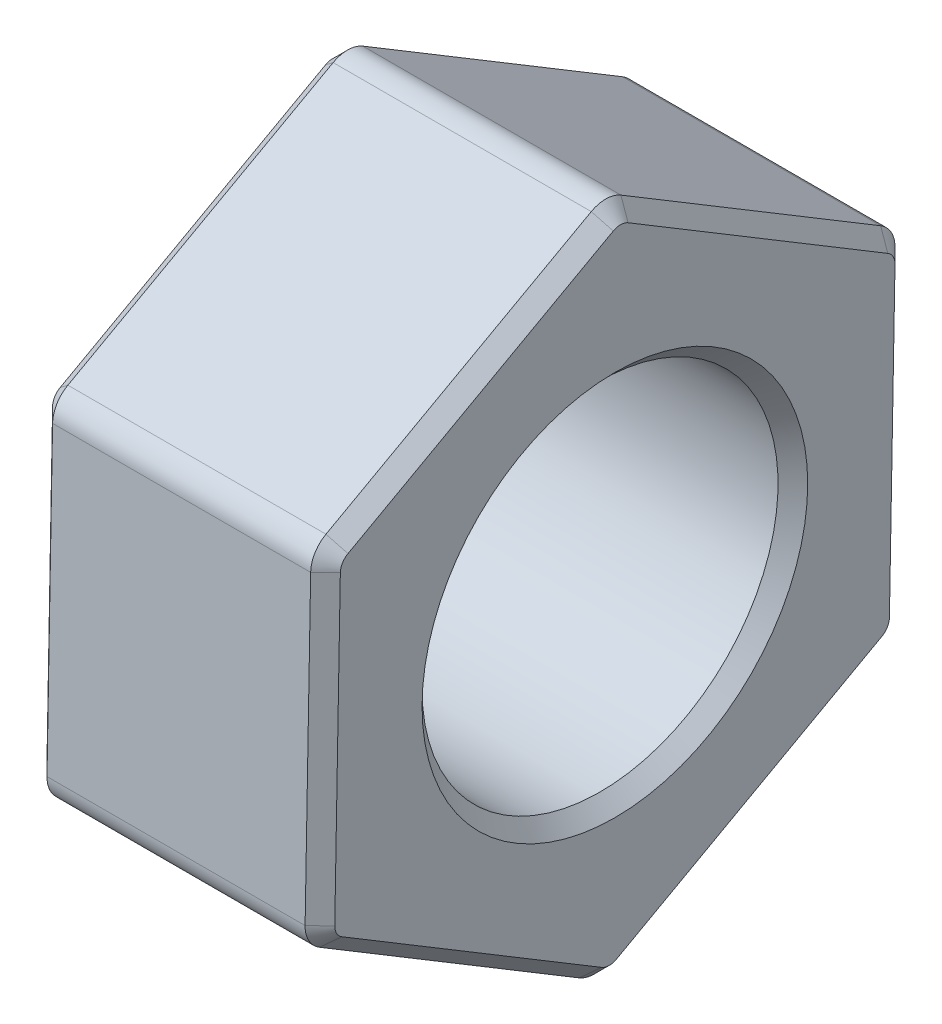
ISO-10303-21;
HEADER;
FILE_DESCRIPTION(('STEP AP214'),'2;1');
FILE_NAME('part.step','',(''),(''),'','','');
FILE_SCHEMA(('AUTOMOTIVE_DESIGN { 1 0 10303 214 1 1 1 1 }'));
ENDSEC;
DATA;
#1=APPLICATION_CONTEXT('core data for automotive mechanical design processes');
#2=APPLICATION_PROTOCOL_DEFINITION('international standard','automotive_design',2000,#1);
#3=PRODUCT_CONTEXT('',#1,'mechanical');
#4=PRODUCT('Part','Part','',(#3));
#5=PRODUCT_RELATED_PRODUCT_CATEGORY('part','',(#4));
#6=PRODUCT_DEFINITION_FORMATION('','',#4);
#7=PRODUCT_DEFINITION_CONTEXT('part definition',#1,'design');
#8=PRODUCT_DEFINITION('design','',#6,#7);
#9=PRODUCT_DEFINITION_SHAPE('','',#8);
#10=(LENGTH_UNIT() NAMED_UNIT(*) SI_UNIT(.MILLI.,.METRE.));
#11=(NAMED_UNIT(*) PLANE_ANGLE_UNIT() SI_UNIT($,.RADIAN.));
#12=(NAMED_UNIT(*) SI_UNIT($,.STERADIAN.) SOLID_ANGLE_UNIT());
#13=UNCERTAINTY_MEASURE_WITH_UNIT(LENGTH_MEASURE(1.E-05),#10,'distance_accuracy_value','');
#14=(GEOMETRIC_REPRESENTATION_CONTEXT(3) GLOBAL_UNCERTAINTY_ASSIGNED_CONTEXT((#13)) GLOBAL_UNIT_ASSIGNED_CONTEXT((#10,
#11,#12)) REPRESENTATION_CONTEXT('',''));
#15=CARTESIAN_POINT('',(0.,0.,0.));
#16=DIRECTION('',(0.,0.,1.));
#17=DIRECTION('',(1.,0.,0.));
#18=AXIS2_PLACEMENT_3D('',#15,#16,#17);
#19=CARTESIAN_POINT('',(4.85,2.47301348110481,-4.47120837383742));
#20=DIRECTION('',(-1.,0.,0.));
#21=DIRECTION('',(0.,0.,1.));
#22=AXIS2_PLACEMENT_3D('',#19,#20,#21);
#23=PLANE('',#22);
#24=CARTESIAN_POINT('',(4.85,0.,0.));
#25=DIRECTION('',(-1.,0.,0.));
#26=DIRECTION('',(0.,0.,1.));
#27=AXIS2_PLACEMENT_3D('',#24,#25,#26);
#28=CIRCLE('',#27,3.25);
#29=CARTESIAN_POINT('',(4.85,0.,3.25));
#30=VERTEX_POINT('',#29);
#31=EDGE_CURVE('E11',#30,#30,#28,.T.);
#32=ORIENTED_EDGE('',*,*,#31,.T.);
#33=EDGE_LOOP('',(#32));
#34=FACE_BOUND('',#33,.T.);
#35=CARTESIAN_POINT('',(4.85,-2.63567329680451,-4.37729668545686));
#36=DIRECTION('',(-1.,0.,0.));
#37=DIRECTION('',(0.,0.,1.));
#38=AXIS2_PLACEMENT_3D('',#35,#36,#37);
#39=CIRCLE('',#38,0.250000000000004);
#40=CARTESIAN_POINT('',(4.85,-2.85444053055349,-4.49829626164546));
#41=VERTEX_POINT('',#40);
#42=CARTESIAN_POINT('',(4.85,-2.64026820685252,-4.62725445549343));
#43=VERTEX_POINT('',#42);
#44=EDGE_CURVE('E49',#41,#43,#39,.F.);
#45=ORIENTED_EDGE('',*,*,#44,.T.);
#46=DIRECTION('',(0.,0.999831080146247,-0.0183796401920564));
#47=VECTOR('',#46,1.);
#48=CARTESIAN_POINT('',(4.85,2.46841857105679,-4.72116614387398));
#49=LINE('',#48,#47);
#50=CARTESIAN_POINT('',(4.85,2.46841857105679,-4.72116614387398));
#51=VERTEX_POINT('',#50);
#52=EDGE_CURVE('E41',#43,#51,#49,.T.);
#53=ORIENTED_EDGE('',*,*,#52,.T.);
#54=CARTESIAN_POINT('',(4.85,2.47301348110481,-4.47120837383742));
#55=DIRECTION('',(-1.,0.,0.));
#56=DIRECTION('',(0.,0.,1.));
#57=AXIS2_PLACEMENT_3D('',#54,#55,#56);
#58=CIRCLE('',#57,0.250000000000004);
#59=CARTESIAN_POINT('',(4.85,2.68718580480578,-4.60016656768538));
#60=VERTEX_POINT('',#59);
#61=EDGE_CURVE('E284',#51,#60,#58,.F.);
#62=ORIENTED_EDGE('',*,*,#61,.T.);
#63=DIRECTION('',(0.,0.515832775391862,0.856689294803856));
#64=VECTOR('',#63,1.);
#65=CARTESIAN_POINT('',(4.85,2.68718580480578,-4.60016656768539));
#66=LINE('',#65,#64);
#67=CARTESIAN_POINT('',(4.85,5.32285910161029,-0.222869882228528));
#68=VERTEX_POINT('',#67);
#69=EDGE_CURVE('E286',#60,#68,#66,.T.);
#70=ORIENTED_EDGE('',*,*,#69,.T.);
#71=CARTESIAN_POINT('',(4.85,5.10868677790932,-0.0939116883805591));
#72=DIRECTION('',(-1.,0.,0.));
#73=DIRECTION('',(0.,0.,1.));
#74=AXIS2_PLACEMENT_3D('',#71,#72,#73);
#75=CIRCLE('',#74,0.250000000000004);
#76=CARTESIAN_POINT('',(4.85,5.3274540116583,0.0270878878080406));
#77=VERTEX_POINT('',#76);
#78=EDGE_CURVE('E288',#68,#77,#75,.F.);
#79=ORIENTED_EDGE('',*,*,#78,.T.);
#80=DIRECTION('',(0.,-0.483998304754384,0.875068934995913));
#81=VECTOR('',#80,1.);
#82=CARTESIAN_POINT('',(4.85,6.56396075221071,-2.20851629911067));
#83=LINE('',#82,#81);
#84=CARTESIAN_POINT('',(4.85,2.85444053055349,4.49829626164546));
#85=VERTEX_POINT('',#84);
#86=EDGE_CURVE('E290',#77,#85,#83,.T.);
#87=ORIENTED_EDGE('',*,*,#86,.T.);
#88=CARTESIAN_POINT('',(4.85,2.63567329680451,4.37729668545686));
#89=DIRECTION('',(-1.,0.,0.));
#90=DIRECTION('',(0.,0.,1.));
#91=AXIS2_PLACEMENT_3D('',#88,#89,#90);
#92=CIRCLE('',#91,0.250000000000004);
#93=CARTESIAN_POINT('',(4.85,2.64026820685252,4.62725445549343));
#94=VERTEX_POINT('',#93);
#95=EDGE_CURVE('E292',#85,#94,#92,.F.);
#96=ORIENTED_EDGE('',*,*,#95,.T.);
#97=DIRECTION('',(0.,-0.999831080146247,0.0183796401920565));
#98=VECTOR('',#97,1.);
#99=CARTESIAN_POINT('',(4.85,2.64026820685252,4.62725445549343));
#100=LINE('',#99,#98);
#101=CARTESIAN_POINT('',(4.85,-2.46841857105679,4.72116614387399));
#102=VERTEX_POINT('',#101);
#103=EDGE_CURVE('E294',#94,#102,#100,.T.);
#104=ORIENTED_EDGE('',*,*,#103,.T.);
#105=CARTESIAN_POINT('',(4.85,-2.47301348110481,4.47120837383742));
#106=DIRECTION('',(-1.,0.,0.));
#107=DIRECTION('',(0.,0.,1.));
#108=AXIS2_PLACEMENT_3D('',#105,#106,#107);
#109=CIRCLE('',#108,0.250000000000004);
#110=CARTESIAN_POINT('',(4.85,-2.68718580480578,4.60016656768539));
#111=VERTEX_POINT('',#110);
#112=EDGE_CURVE('E296',#102,#111,#109,.F.);
#113=ORIENTED_EDGE('',*,*,#112,.T.);
#114=DIRECTION('',(0.,-0.515832775391862,-0.856689294803857));
#115=VECTOR('',#114,1.);
#116=CARTESIAN_POINT('',(4.85,-5.32285910161029,0.222869882228527));
#117=LINE('',#116,#115);
#118=CARTESIAN_POINT('',(4.85,-5.32285910161029,0.222869882228528));
#119=VERTEX_POINT('',#118);
#120=EDGE_CURVE('E298',#111,#119,#117,.T.);
#121=ORIENTED_EDGE('',*,*,#120,.T.);
#122=CARTESIAN_POINT('',(4.85,-5.10868677790932,0.09391168838056));
#123=DIRECTION('',(-1.,0.,0.));
#124=DIRECTION('',(0.,0.,1.));
#125=AXIS2_PLACEMENT_3D('',#122,#123,#124);
#126=CIRCLE('',#125,0.250000000000004);
#127=CARTESIAN_POINT('',(4.85,-5.3274540116583,-0.0270878878080397));
#128=VERTEX_POINT('',#127);
#129=EDGE_CURVE('E300',#119,#128,#126,.F.);
#130=ORIENTED_EDGE('',*,*,#129,.T.);
#131=DIRECTION('',(0.,0.483998304754385,-0.875068934995913));
#132=VECTOR('',#131,1.);
#133=CARTESIAN_POINT('',(4.85,-1.61793379000109,-6.73390044856417));
#134=LINE('',#133,#132);
#135=EDGE_CURVE('E54',#128,#41,#134,.T.);
#136=ORIENTED_EDGE('',*,*,#135,.T.);
#137=EDGE_LOOP('',(#45,#53,#62,#70,#79,#87,#96,#104,#113,#121,#130,#136));
#138=FACE_BOUND('',#137,.T.);
#139=ADVANCED_FACE('F32',(#34,#138),#23,.F.);
#140=CARTESIAN_POINT('',(0.,2.47301348110481,-4.47120837383742));
#141=DIRECTION('',(-1.,0.,0.));
#142=DIRECTION('',(0.,0.,1.));
#143=AXIS2_PLACEMENT_3D('',#140,#141,#142);
#144=PLANE('',#143);
#145=CARTESIAN_POINT('',(0.,0.,0.));
#146=DIRECTION('',(-1.,0.,0.));
#147=DIRECTION('',(0.,0.,1.));
#148=AXIS2_PLACEMENT_3D('',#145,#146,#147);
#149=CIRCLE('',#148,3.25);
#150=CARTESIAN_POINT('',(0.,0.,3.25));
#151=VERTEX_POINT('',#150);
#152=EDGE_CURVE('E222',#151,#151,#149,.F.);
#153=ORIENTED_EDGE('',*,*,#152,.T.);
#154=EDGE_LOOP('',(#153));
#155=FACE_BOUND('',#154,.T.);
#156=CARTESIAN_POINT('',(0.,5.10868677790932,-0.0939116883805591));
#157=DIRECTION('',(-1.,0.,0.));
#158=DIRECTION('',(0.,0.,1.));
#159=AXIS2_PLACEMENT_3D('',#156,#157,#158);
#160=CIRCLE('',#159,0.249999999999998);
#161=CARTESIAN_POINT('',(0.,5.3274540116583,0.0270878878080372));
#162=VERTEX_POINT('',#161);
#163=CARTESIAN_POINT('',(0.,5.32285910161028,-0.222869882228526));
#164=VERTEX_POINT('',#163);
#165=EDGE_CURVE('E221',#162,#164,#160,.T.);
#166=ORIENTED_EDGE('',*,*,#165,.T.);
#167=DIRECTION('',(0.,-0.515832775391862,-0.856689294803856));
#168=VECTOR('',#167,1.);
#169=CARTESIAN_POINT('',(0.,2.68718580480577,-4.60016656768538));
#170=LINE('',#169,#168);
#171=CARTESIAN_POINT('',(0.,2.68718580480577,-4.60016656768538));
#172=VERTEX_POINT('',#171);
#173=EDGE_CURVE('E200',#164,#172,#170,.T.);
#174=ORIENTED_EDGE('',*,*,#173,.T.);
#175=CARTESIAN_POINT('',(0.,2.47301348110481,-4.47120837383742));
#176=DIRECTION('',(-1.,0.,0.));
#177=DIRECTION('',(0.,0.,1.));
#178=AXIS2_PLACEMENT_3D('',#175,#176,#177);
#179=CIRCLE('',#178,0.249999999999998);
#180=CARTESIAN_POINT('',(0.,2.46841857105679,-4.72116614387398));
#181=VERTEX_POINT('',#180);
#182=EDGE_CURVE('E210',#172,#181,#179,.T.);
#183=ORIENTED_EDGE('',*,*,#182,.T.);
#184=DIRECTION('',(0.,-0.999831080146247,0.0183796401920564));
#185=VECTOR('',#184,1.);
#186=CARTESIAN_POINT('',(0.,-2.64026820685252,-4.62725445549342));
#187=LINE('',#186,#185);
#188=CARTESIAN_POINT('',(0.,-2.64026820685252,-4.62725445549342));
#189=VERTEX_POINT('',#188);
#190=EDGE_CURVE('E216',#181,#189,#187,.T.);
#191=ORIENTED_EDGE('',*,*,#190,.T.);
#192=CARTESIAN_POINT('',(0.,-2.63567329680451,-4.37729668545686));
#193=DIRECTION('',(-1.,0.,0.));
#194=DIRECTION('',(0.,0.,1.));
#195=AXIS2_PLACEMENT_3D('',#192,#193,#194);
#196=CIRCLE('',#195,0.249999999999998);
#197=CARTESIAN_POINT('',(0.,-2.85444053055349,-4.49829626164546));
#198=VERTEX_POINT('',#197);
#199=EDGE_CURVE('E407',#189,#198,#196,.T.);
#200=ORIENTED_EDGE('',*,*,#199,.T.);
#201=DIRECTION('',(0.,-0.483998304754385,0.875068934995913));
#202=VECTOR('',#201,1.);
#203=CARTESIAN_POINT('',(0.,-5.3274540116583,-0.0270878878080373));
#204=LINE('',#203,#202);
#205=CARTESIAN_POINT('',(0.,-5.3274540116583,-0.0270878878080365));
#206=VERTEX_POINT('',#205);
#207=EDGE_CURVE('E409',#198,#206,#204,.T.);
#208=ORIENTED_EDGE('',*,*,#207,.T.);
#209=CARTESIAN_POINT('',(0.,-5.10868677790932,0.09391168838056));
#210=DIRECTION('',(-1.,0.,0.));
#211=DIRECTION('',(0.,0.,1.));
#212=AXIS2_PLACEMENT_3D('',#209,#210,#211);
#213=CIRCLE('',#212,0.249999999999998);
#214=CARTESIAN_POINT('',(0.,-5.32285910161028,0.222869882228527));
#215=VERTEX_POINT('',#214);
#216=EDGE_CURVE('E411',#206,#215,#213,.T.);
#217=ORIENTED_EDGE('',*,*,#216,.T.);
#218=DIRECTION('',(0.,0.515832775391862,0.856689294803857));
#219=VECTOR('',#218,1.);
#220=CARTESIAN_POINT('',(0.,-2.68718580480577,4.60016656768538));
#221=LINE('',#220,#219);
#222=CARTESIAN_POINT('',(0.,-2.68718580480577,4.60016656768538));
#223=VERTEX_POINT('',#222);
#224=EDGE_CURVE('E413',#215,#223,#221,.T.);
#225=ORIENTED_EDGE('',*,*,#224,.T.);
#226=CARTESIAN_POINT('',(0.,-2.47301348110481,4.47120837383742));
#227=DIRECTION('',(-1.,0.,0.));
#228=DIRECTION('',(0.,0.,1.));
#229=AXIS2_PLACEMENT_3D('',#226,#227,#228);
#230=CIRCLE('',#229,0.249999999999998);
#231=CARTESIAN_POINT('',(0.,-2.46841857105679,4.72116614387398));
#232=VERTEX_POINT('',#231);
#233=EDGE_CURVE('E415',#223,#232,#230,.T.);
#234=ORIENTED_EDGE('',*,*,#233,.T.);
#235=DIRECTION('',(0.,0.999831080146247,-0.0183796401920565));
#236=VECTOR('',#235,1.);
#237=CARTESIAN_POINT('',(0.,2.64026820685252,4.62725445549342));
#238=LINE('',#237,#236);
#239=CARTESIAN_POINT('',(0.,2.64026820685252,4.62725445549342));
#240=VERTEX_POINT('',#239);
#241=EDGE_CURVE('E417',#232,#240,#238,.T.);
#242=ORIENTED_EDGE('',*,*,#241,.T.);
#243=CARTESIAN_POINT('',(0.,2.63567329680451,4.37729668545686));
#244=DIRECTION('',(-1.,0.,0.));
#245=DIRECTION('',(0.,0.,1.));
#246=AXIS2_PLACEMENT_3D('',#243,#244,#245);
#247=CIRCLE('',#246,0.249999999999998);
#248=CARTESIAN_POINT('',(0.,2.85444053055349,4.49829626164546));
#249=VERTEX_POINT('',#248);
#250=EDGE_CURVE('E419',#240,#249,#247,.T.);
#251=ORIENTED_EDGE('',*,*,#250,.T.);
#252=DIRECTION('',(0.,0.483998304754384,-0.875068934995913));
#253=VECTOR('',#252,1.);
#254=CARTESIAN_POINT('',(0.,5.3274540116583,0.0270878878080382));
#255=LINE('',#254,#253);
#256=EDGE_CURVE('E227',#249,#162,#255,.T.);
#257=ORIENTED_EDGE('',*,*,#256,.T.);
#258=EDGE_LOOP('',(#166,#174,#183,#191,#200,#208,#217,#225,#234,#242,#251,#257));
#259=FACE_BOUND('',#258,.T.);
#260=ADVANCED_FACE('F219',(#155,#259),#144,.T.);
#261=CARTESIAN_POINT('',(4.85,2.47301348110481,-4.47120837383742));
#262=DIRECTION('',(-1.,0.,0.));
#263=DIRECTION('',(0.,0.,1.));
#264=AXIS2_PLACEMENT_3D('',#261,#262,#263);
#265=CYLINDRICAL_SURFACE('',#264,0.5);
#266=DIRECTION('',(-1.,0.,0.));
#267=VECTOR('',#266,1.);
#268=CARTESIAN_POINT('',(4.85,2.46382366100878,-4.97112391391054));
#269=LINE('',#268,#267);
#270=CARTESIAN_POINT('',(4.6,2.46382366100878,-4.97112391391054));
#271=VERTEX_POINT('',#270);
#272=CARTESIAN_POINT('',(0.250000000000003,2.46382366100878,-4.97112391391054));
#273=VERTEX_POINT('',#272);
#274=EDGE_CURVE('E333',#271,#273,#269,.T.);
#275=ORIENTED_EDGE('',*,*,#274,.T.);
#276=CARTESIAN_POINT('',(0.250000000000003,2.47301348110481,-4.47120837383742));
#277=DIRECTION('',(-1.,0.,0.));
#278=DIRECTION('',(0.,0.,1.));
#279=AXIS2_PLACEMENT_3D('',#276,#277,#278);
#280=CIRCLE('',#279,0.5);
#281=CARTESIAN_POINT('',(0.250000000000003,2.90135812850674,-4.72912476153335));
#282=VERTEX_POINT('',#281);
#283=EDGE_CURVE('E282',#273,#282,#280,.F.);
#284=ORIENTED_EDGE('',*,*,#283,.T.);
#285=DIRECTION('',(-1.,0.,0.));
#286=VECTOR('',#285,1.);
#287=CARTESIAN_POINT('',(4.85,2.90135812850674,-4.72912476153335));
#288=LINE('',#287,#286);
#289=CARTESIAN_POINT('',(4.6,2.90135812850674,-4.72912476153335));
#290=VERTEX_POINT('',#289);
#291=EDGE_CURVE('E217',#290,#282,#288,.T.);
#292=ORIENTED_EDGE('',*,*,#291,.F.);
#293=CARTESIAN_POINT('',(4.6,2.47301348110481,-4.47120837383742));
#294=DIRECTION('',(-1.,0.,0.));
#295=DIRECTION('',(0.,0.,1.));
#296=AXIS2_PLACEMENT_3D('',#293,#294,#295);
#297=CIRCLE('',#296,0.5);
#298=EDGE_CURVE('E280',#290,#271,#297,.T.);
#299=ORIENTED_EDGE('',*,*,#298,.T.);
#300=EDGE_LOOP('',(#275,#284,#292,#299));
#301=FACE_BOUND('',#300,.T.);
#302=ADVANCED_FACE('F451',(#301),#265,.T.);
#303=CARTESIAN_POINT('',(4.85,2.90135812850674,-4.72912476153335));
#304=DIRECTION('',(0.,-0.856689294803856,0.515832775391862));
#305=DIRECTION('',(0.,-0.515832775391862,-0.856689294803856));
#306=AXIS2_PLACEMENT_3D('',#303,#304,#305);
#307=PLANE('',#306);
#308=ORIENTED_EDGE('',*,*,#291,.T.);
#309=DIRECTION('',(0.,0.515832775391862,0.856689294803856));
#310=VECTOR('',#309,1.);
#311=CARTESIAN_POINT('',(0.250000000000003,5.53703142531125,-0.351828076076492));
#312=LINE('',#311,#310);
#313=CARTESIAN_POINT('',(0.250000000000003,5.53703142531125,-0.351828076076492));
#314=VERTEX_POINT('',#313);
#315=EDGE_CURVE('E203',#282,#314,#312,.T.);
#316=ORIENTED_EDGE('',*,*,#315,.T.);
#317=DIRECTION('',(-1.,0.,0.));
#318=VECTOR('',#317,1.);
#319=CARTESIAN_POINT('',(4.85,5.53703142531125,-0.351828076076492));
#320=LINE('',#319,#318);
#321=CARTESIAN_POINT('',(4.6,5.53703142531125,-0.351828076076492));
#322=VERTEX_POINT('',#321);
#323=EDGE_CURVE('E401',#322,#314,#320,.T.);
#324=ORIENTED_EDGE('',*,*,#323,.F.);
#325=DIRECTION('',(0.,-0.515832775391862,-0.856689294803856));
#326=VECTOR('',#325,1.);
#327=CARTESIAN_POINT('',(4.6,2.90135812850674,-4.72912476153335));
#328=LINE('',#327,#326);
#329=EDGE_CURVE('E236',#322,#290,#328,.T.);
#330=ORIENTED_EDGE('',*,*,#329,.T.);
#331=EDGE_LOOP('',(#308,#316,#324,#330));
#332=FACE_BOUND('',#331,.T.);
#333=ADVANCED_FACE('F434',(#332),#307,.F.);
#334=CARTESIAN_POINT('',(4.85,5.10868677790932,-0.0939116883805591));
#335=DIRECTION('',(-1.,0.,0.));
#336=DIRECTION('',(0.,0.,1.));
#337=AXIS2_PLACEMENT_3D('',#334,#335,#336);
#338=CYLINDRICAL_SURFACE('',#337,0.5);
#339=ORIENTED_EDGE('',*,*,#323,.T.);
#340=CARTESIAN_POINT('',(0.250000000000003,5.10868677790932,-0.0939116883805591));
#341=DIRECTION('',(-1.,0.,0.));
#342=DIRECTION('',(0.,0.,1.));
#343=AXIS2_PLACEMENT_3D('',#340,#341,#342);
#344=CIRCLE('',#343,0.5);
#345=CARTESIAN_POINT('',(0.250000000000003,5.54622124540728,0.148087463996635));
#346=VERTEX_POINT('',#345);
#347=EDGE_CURVE('E241',#314,#346,#344,.F.);
#348=ORIENTED_EDGE('',*,*,#347,.T.);
#349=DIRECTION('',(-1.,0.,0.));
#350=VECTOR('',#349,1.);
#351=CARTESIAN_POINT('',(4.85,5.54622124540728,0.148087463996635));
#352=LINE('',#351,#350);
#353=CARTESIAN_POINT('',(4.6,5.54622124540728,0.148087463996635));
#354=VERTEX_POINT('',#353);
#355=EDGE_CURVE('E393',#354,#346,#352,.T.);
#356=ORIENTED_EDGE('',*,*,#355,.F.);
#357=CARTESIAN_POINT('',(4.6,5.10868677790932,-0.0939116883805591));
#358=DIRECTION('',(-1.,0.,0.));
#359=DIRECTION('',(0.,0.,1.));
#360=AXIS2_PLACEMENT_3D('',#357,#358,#359);
#361=CIRCLE('',#360,0.5);
#362=EDGE_CURVE('E239',#354,#322,#361,.T.);
#363=ORIENTED_EDGE('',*,*,#362,.T.);
#364=EDGE_LOOP('',(#339,#348,#356,#363));
#365=FACE_BOUND('',#364,.T.);
#366=ADVANCED_FACE('F437',(#365),#338,.T.);
#367=CARTESIAN_POINT('',(4.85,5.54622124540728,0.148087463996635));
#368=DIRECTION('',(0.,-0.875068934995913,-0.483998304754384));
#369=DIRECTION('',(0.,0.483998304754384,-0.875068934995913));
#370=AXIS2_PLACEMENT_3D('',#367,#368,#369);
#371=PLANE('',#370);
#372=ORIENTED_EDGE('',*,*,#355,.T.);
#373=DIRECTION('',(0.,-0.483998304754384,0.875068934995913));
#374=VECTOR('',#373,1.);
#375=CARTESIAN_POINT('',(0.250000000000002,3.07320776430247,4.61929583783405));
#376=LINE('',#375,#374);
#377=CARTESIAN_POINT('',(0.250000000000003,3.07320776430247,4.61929583783405));
#378=VERTEX_POINT('',#377);
#379=EDGE_CURVE('E245',#346,#378,#376,.T.);
#380=ORIENTED_EDGE('',*,*,#379,.T.);
#381=DIRECTION('',(-1.,0.,0.));
#382=VECTOR('',#381,1.);
#383=CARTESIAN_POINT('',(4.85,3.07320776430247,4.61929583783405));
#384=LINE('',#383,#382);
#385=CARTESIAN_POINT('',(4.6,3.07320776430247,4.61929583783405));
#386=VERTEX_POINT('',#385);
#387=EDGE_CURVE('E391',#386,#378,#384,.T.);
#388=ORIENTED_EDGE('',*,*,#387,.F.);
#389=DIRECTION('',(0.,0.483998304754384,-0.875068934995913));
#390=VECTOR('',#389,1.);
#391=CARTESIAN_POINT('',(4.6,5.54622124540728,0.148087463996635));
#392=LINE('',#391,#390);
#393=EDGE_CURVE('E243',#386,#354,#392,.T.);
#394=ORIENTED_EDGE('',*,*,#393,.T.);
#395=EDGE_LOOP('',(#372,#380,#388,#394));
#396=FACE_BOUND('',#395,.T.);
#397=ADVANCED_FACE('F538',(#396),#371,.F.);
#398=CARTESIAN_POINT('',(4.85,2.63567329680451,4.37729668545686));
#399=DIRECTION('',(-1.,0.,0.));
#400=DIRECTION('',(0.,0.,1.));
#401=AXIS2_PLACEMENT_3D('',#398,#399,#400);
#402=CYLINDRICAL_SURFACE('',#401,0.5);
#403=ORIENTED_EDGE('',*,*,#387,.T.);
#404=CARTESIAN_POINT('',(0.250000000000003,2.63567329680451,4.37729668545686));
#405=DIRECTION('',(-1.,0.,0.));
#406=DIRECTION('',(0.,0.,1.));
#407=AXIS2_PLACEMENT_3D('',#404,#405,#406);
#408=CIRCLE('',#407,0.5);
#409=CARTESIAN_POINT('',(0.250000000000003,2.64486311690054,4.87721222552999));
#410=VERTEX_POINT('',#409);
#411=EDGE_CURVE('E249',#378,#410,#408,.F.);
#412=ORIENTED_EDGE('',*,*,#411,.T.);
#413=DIRECTION('',(-1.,0.,0.));
#414=VECTOR('',#413,1.);
#415=CARTESIAN_POINT('',(4.85,2.64486311690054,4.87721222552999));
#416=LINE('',#415,#414);
#417=CARTESIAN_POINT('',(4.6,2.64486311690054,4.87721222552999));
#418=VERTEX_POINT('',#417);
#419=EDGE_CURVE('E382',#418,#410,#416,.T.);
#420=ORIENTED_EDGE('',*,*,#419,.F.);
#421=CARTESIAN_POINT('',(4.6,2.63567329680451,4.37729668545686));
#422=DIRECTION('',(-1.,0.,0.));
#423=DIRECTION('',(0.,0.,1.));
#424=AXIS2_PLACEMENT_3D('',#421,#422,#423);
#425=CIRCLE('',#424,0.5);
#426=EDGE_CURVE('E247',#418,#386,#425,.T.);
#427=ORIENTED_EDGE('',*,*,#426,.T.);
#428=EDGE_LOOP('',(#403,#412,#420,#427));
#429=FACE_BOUND('',#428,.T.);
#430=ADVANCED_FACE('F388',(#429),#402,.T.);
#431=CARTESIAN_POINT('',(4.85,2.64486311690054,4.87721222552999));
#432=DIRECTION('',(0.,-0.0183796401920565,-0.999831080146247));
#433=DIRECTION('',(0.,0.999831080146247,-0.0183796401920565));
#434=AXIS2_PLACEMENT_3D('',#431,#432,#433);
#435=PLANE('',#434);
#436=ORIENTED_EDGE('',*,*,#419,.T.);
#437=DIRECTION('',(0.,-0.999831080146247,0.0183796401920565));
#438=VECTOR('',#437,1.);
#439=CARTESIAN_POINT('',(0.250000000000003,-2.46382366100878,4.97112391391054));
#440=LINE('',#439,#438);
#441=CARTESIAN_POINT('',(0.250000000000003,-2.46382366100878,4.97112391391054));
#442=VERTEX_POINT('',#441);
#443=EDGE_CURVE('E253',#410,#442,#440,.T.);
#444=ORIENTED_EDGE('',*,*,#443,.T.);
#445=DIRECTION('',(-1.,0.,0.));
#446=VECTOR('',#445,1.);
#447=CARTESIAN_POINT('',(4.85,-2.46382366100878,4.97112391391054));
#448=LINE('',#447,#446);
#449=CARTESIAN_POINT('',(4.6,-2.46382366100878,4.97112391391054));
#450=VERTEX_POINT('',#449);
#451=EDGE_CURVE('E385',#450,#442,#448,.T.);
#452=ORIENTED_EDGE('',*,*,#451,.F.);
#453=DIRECTION('',(0.,0.999831080146247,-0.0183796401920565));
#454=VECTOR('',#453,1.);
#455=CARTESIAN_POINT('',(4.6,2.64486311690054,4.87721222552999));
#456=LINE('',#455,#454);
#457=EDGE_CURVE('E251',#450,#418,#456,.T.);
#458=ORIENTED_EDGE('',*,*,#457,.T.);
#459=EDGE_LOOP('',(#436,#444,#452,#458));
#460=FACE_BOUND('',#459,.T.);
#461=ADVANCED_FACE('F381',(#460),#435,.F.);
#462=CARTESIAN_POINT('',(4.85,-2.47301348110481,4.47120837383742));
#463=DIRECTION('',(-1.,0.,0.));
#464=DIRECTION('',(0.,0.,1.));
#465=AXIS2_PLACEMENT_3D('',#462,#463,#464);
#466=CYLINDRICAL_SURFACE('',#465,0.5);
#467=ORIENTED_EDGE('',*,*,#451,.T.);
#468=CARTESIAN_POINT('',(0.250000000000003,-2.47301348110481,4.47120837383742));
#469=DIRECTION('',(-1.,0.,0.));
#470=DIRECTION('',(0.,0.,1.));
#471=AXIS2_PLACEMENT_3D('',#468,#469,#470);
#472=CIRCLE('',#471,0.5);
#473=CARTESIAN_POINT('',(0.250000000000003,-2.90135812850674,4.72912476153335));
#474=VERTEX_POINT('',#473);
#475=EDGE_CURVE('E257',#442,#474,#472,.F.);
#476=ORIENTED_EDGE('',*,*,#475,.T.);
#477=DIRECTION('',(-1.,0.,0.));
#478=VECTOR('',#477,1.);
#479=CARTESIAN_POINT('',(4.85,-2.90135812850674,4.72912476153335));
#480=LINE('',#479,#478);
#481=CARTESIAN_POINT('',(4.6,-2.90135812850674,4.72912476153335));
#482=VERTEX_POINT('',#481);
#483=EDGE_CURVE('E395',#482,#474,#480,.T.);
#484=ORIENTED_EDGE('',*,*,#483,.F.);
#485=CARTESIAN_POINT('',(4.6,-2.47301348110481,4.47120837383742));
#486=DIRECTION('',(-1.,0.,0.));
#487=DIRECTION('',(0.,0.,1.));
#488=AXIS2_PLACEMENT_3D('',#485,#486,#487);
#489=CIRCLE('',#488,0.5);
#490=EDGE_CURVE('E255',#482,#450,#489,.T.);
#491=ORIENTED_EDGE('',*,*,#490,.T.);
#492=EDGE_LOOP('',(#467,#476,#484,#491));
#493=FACE_BOUND('',#492,.T.);
#494=ADVANCED_FACE('F529',(#493),#466,.T.);
#495=CARTESIAN_POINT('',(4.85,-2.90135812850674,4.72912476153335));
#496=DIRECTION('',(0.,0.856689294803857,-0.515832775391862));
#497=DIRECTION('',(0.,0.515832775391862,0.856689294803857));
#498=AXIS2_PLACEMENT_3D('',#495,#496,#497);
#499=PLANE('',#498);
#500=ORIENTED_EDGE('',*,*,#483,.T.);
#501=DIRECTION('',(0.,-0.515832775391862,-0.856689294803857));
#502=VECTOR('',#501,1.);
#503=CARTESIAN_POINT('',(0.250000000000003,-5.53703142531125,0.351828076076493));
#504=LINE('',#503,#502);
#505=CARTESIAN_POINT('',(0.250000000000003,-5.53703142531125,0.351828076076493));
#506=VERTEX_POINT('',#505);
#507=EDGE_CURVE('E261',#474,#506,#504,.T.);
#508=ORIENTED_EDGE('',*,*,#507,.T.);
#509=DIRECTION('',(-1.,0.,0.));
#510=VECTOR('',#509,1.);
#511=CARTESIAN_POINT('',(4.85,-5.53703142531125,0.351828076076493));
#512=LINE('',#511,#510);
#513=CARTESIAN_POINT('',(4.6,-5.53703142531125,0.351828076076493));
#514=VERTEX_POINT('',#513);
#515=EDGE_CURVE('E874',#514,#506,#512,.T.);
#516=ORIENTED_EDGE('',*,*,#515,.F.);
#517=DIRECTION('',(0.,0.515832775391862,0.856689294803857));
#518=VECTOR('',#517,1.);
#519=CARTESIAN_POINT('',(4.6,-2.90135812850674,4.72912476153335));
#520=LINE('',#519,#518);
#521=EDGE_CURVE('E259',#514,#482,#520,.T.);
#522=ORIENTED_EDGE('',*,*,#521,.T.);
#523=EDGE_LOOP('',(#500,#508,#516,#522));
#524=FACE_BOUND('',#523,.T.);
#525=ADVANCED_FACE('F525',(#524),#499,.F.);
#526=CARTESIAN_POINT('',(4.85,-5.10868677790932,0.09391168838056));
#527=DIRECTION('',(-1.,0.,0.));
#528=DIRECTION('',(0.,0.,1.));
#529=AXIS2_PLACEMENT_3D('',#526,#527,#528);
#530=CYLINDRICAL_SURFACE('',#529,0.5);
#531=ORIENTED_EDGE('',*,*,#515,.T.);
#532=CARTESIAN_POINT('',(0.250000000000003,-5.10868677790932,0.09391168838056));
#533=DIRECTION('',(-1.,0.,0.));
#534=DIRECTION('',(0.,0.,1.));
#535=AXIS2_PLACEMENT_3D('',#532,#533,#534);
#536=CIRCLE('',#535,0.5);
#537=CARTESIAN_POINT('',(0.250000000000003,-5.54622124540728,-0.148087463996634));
#538=VERTEX_POINT('',#537);
#539=EDGE_CURVE('E265',#506,#538,#536,.F.);
#540=ORIENTED_EDGE('',*,*,#539,.T.);
#541=DIRECTION('',(-1.,0.,0.));
#542=VECTOR('',#541,1.);
#543=CARTESIAN_POINT('',(4.85,-5.54622124540728,-0.148087463996634));
#544=LINE('',#543,#542);
#545=CARTESIAN_POINT('',(4.6,-5.54622124540728,-0.148087463996634));
#546=VERTEX_POINT('',#545);
#547=EDGE_CURVE('E869',#546,#538,#544,.T.);
#548=ORIENTED_EDGE('',*,*,#547,.F.);
#549=CARTESIAN_POINT('',(4.6,-5.10868677790932,0.09391168838056));
#550=DIRECTION('',(-1.,0.,0.));
#551=DIRECTION('',(0.,0.,1.));
#552=AXIS2_PLACEMENT_3D('',#549,#550,#551);
#553=CIRCLE('',#552,0.5);
#554=EDGE_CURVE('E263',#546,#514,#553,.T.);
#555=ORIENTED_EDGE('',*,*,#554,.T.);
#556=EDGE_LOOP('',(#531,#540,#548,#555));
#557=FACE_BOUND('',#556,.T.);
#558=ADVANCED_FACE('F521',(#557),#530,.T.);
#559=CARTESIAN_POINT('',(4.85,-5.54622124540728,-0.148087463996634));
#560=DIRECTION('',(0.,0.875068934995913,0.483998304754385));
#561=DIRECTION('',(0.,-0.483998304754385,0.875068934995913));
#562=AXIS2_PLACEMENT_3D('',#559,#560,#561);
#563=PLANE('',#562);
#564=ORIENTED_EDGE('',*,*,#547,.T.);
#565=DIRECTION('',(0.,0.483998304754385,-0.875068934995913));
#566=VECTOR('',#565,1.);
#567=CARTESIAN_POINT('',(0.250000000000003,-3.07320776430247,-4.61929583783405));
#568=LINE('',#567,#566);
#569=CARTESIAN_POINT('',(0.250000000000003,-3.07320776430247,-4.61929583783405));
#570=VERTEX_POINT('',#569);
#571=EDGE_CURVE('E269',#538,#570,#568,.T.);
#572=ORIENTED_EDGE('',*,*,#571,.T.);
#573=DIRECTION('',(-1.,0.,0.));
#574=VECTOR('',#573,1.);
#575=CARTESIAN_POINT('',(4.85,-3.07320776430247,-4.61929583783405));
#576=LINE('',#575,#574);
#577=CARTESIAN_POINT('',(4.6,-3.07320776430247,-4.61929583783405));
#578=VERTEX_POINT('',#577);
#579=EDGE_CURVE('E867',#578,#570,#576,.T.);
#580=ORIENTED_EDGE('',*,*,#579,.F.);
#581=DIRECTION('',(0.,-0.483998304754385,0.875068934995913));
#582=VECTOR('',#581,1.);
#583=CARTESIAN_POINT('',(4.6,-5.54622124540728,-0.148087463996634));
#584=LINE('',#583,#582);
#585=EDGE_CURVE('E267',#578,#546,#584,.T.);
#586=ORIENTED_EDGE('',*,*,#585,.T.);
#587=EDGE_LOOP('',(#564,#572,#580,#586));
#588=FACE_BOUND('',#587,.T.);
#589=ADVANCED_FACE('F517',(#588),#563,.F.);
#590=CARTESIAN_POINT('',(4.85,-2.63567329680451,-4.37729668545686));
#591=DIRECTION('',(-1.,0.,0.));
#592=DIRECTION('',(0.,0.,1.));
#593=AXIS2_PLACEMENT_3D('',#590,#591,#592);
#594=CYLINDRICAL_SURFACE('',#593,0.5);
#595=ORIENTED_EDGE('',*,*,#579,.T.);
#596=CARTESIAN_POINT('',(0.250000000000003,-2.63567329680451,-4.37729668545686));
#597=DIRECTION('',(-1.,0.,0.));
#598=DIRECTION('',(0.,0.,1.));
#599=AXIS2_PLACEMENT_3D('',#596,#597,#598);
#600=CIRCLE('',#599,0.5);
#601=CARTESIAN_POINT('',(0.250000000000003,-2.64486311690054,-4.87721222552999));
#602=VERTEX_POINT('',#601);
#603=EDGE_CURVE('E273',#570,#602,#600,.F.);
#604=ORIENTED_EDGE('',*,*,#603,.T.);
#605=DIRECTION('',(-1.,0.,0.));
#606=VECTOR('',#605,1.);
#607=CARTESIAN_POINT('',(4.85,-2.64486311690054,-4.87721222552999));
#608=LINE('',#607,#606);
#609=CARTESIAN_POINT('',(4.6,-2.64486311690054,-4.87721222552999));
#610=VERTEX_POINT('',#609);
#611=EDGE_CURVE('E455',#610,#602,#608,.T.);
#612=ORIENTED_EDGE('',*,*,#611,.F.);
#613=CARTESIAN_POINT('',(4.6,-2.63567329680451,-4.37729668545686));
#614=DIRECTION('',(-1.,0.,0.));
#615=DIRECTION('',(0.,0.,1.));
#616=AXIS2_PLACEMENT_3D('',#613,#614,#615);
#617=CIRCLE('',#616,0.5);
#618=EDGE_CURVE('E271',#610,#578,#617,.T.);
#619=ORIENTED_EDGE('',*,*,#618,.T.);
#620=EDGE_LOOP('',(#595,#604,#612,#619));
#621=FACE_BOUND('',#620,.T.);
#622=ADVANCED_FACE('F514',(#621),#594,.T.);
#623=CARTESIAN_POINT('',(4.85,-2.64486311690054,-4.87721222552999));
#624=DIRECTION('',(0.,0.0183796401920564,0.999831080146247));
#625=DIRECTION('',(0.,-0.999831080146247,0.0183796401920564));
#626=AXIS2_PLACEMENT_3D('',#623,#624,#625);
#627=PLANE('',#626);
#628=ORIENTED_EDGE('',*,*,#611,.T.);
#629=DIRECTION('',(0.,0.999831080146247,-0.0183796401920564));
#630=VECTOR('',#629,1.);
#631=CARTESIAN_POINT('',(0.250000000000003,2.46382366100878,-4.97112391391054));
#632=LINE('',#631,#630);
#633=EDGE_CURVE('E278',#602,#273,#632,.T.);
#634=ORIENTED_EDGE('',*,*,#633,.T.);
#635=ORIENTED_EDGE('',*,*,#274,.F.);
#636=DIRECTION('',(0.,-0.999831080146247,0.0183796401920564));
#637=VECTOR('',#636,1.);
#638=CARTESIAN_POINT('',(4.6,-2.64486311690054,-4.87721222552999));
#639=LINE('',#638,#637);
#640=EDGE_CURVE('E275',#271,#610,#639,.T.);
#641=ORIENTED_EDGE('',*,*,#640,.T.);
#642=EDGE_LOOP('',(#628,#634,#635,#641));
#643=FACE_BOUND('',#642,.T.);
#644=ADVANCED_FACE('F511',(#643),#627,.F.);
#645=CARTESIAN_POINT('',(4.85,0.,0.));
#646=DIRECTION('',(-1.,0.,0.));
#647=DIRECTION('',(0.,0.,1.));
#648=AXIS2_PLACEMENT_3D('',#645,#646,#647);
#649=CYLINDRICAL_SURFACE('',#648,3.);
#650=CARTESIAN_POINT('',(0.25,0.,0.));
#651=DIRECTION('',(-1.,0.,0.));
#652=DIRECTION('',(0.,0.,1.));
#653=AXIS2_PLACEMENT_3D('',#650,#651,#652);
#654=CIRCLE('',#653,3.);
#655=CARTESIAN_POINT('',(0.25,0.,3.));
#656=VERTEX_POINT('',#655);
#657=EDGE_CURVE('E233',#656,#656,#654,.T.);
#658=ORIENTED_EDGE('',*,*,#657,.T.);
#659=EDGE_LOOP('',(#658));
#660=FACE_BOUND('',#659,.T.);
#661=CARTESIAN_POINT('',(4.6,0.,0.));
#662=DIRECTION('',(-1.,0.,0.));
#663=DIRECTION('',(0.,0.,1.));
#664=AXIS2_PLACEMENT_3D('',#661,#662,#663);
#665=CIRCLE('',#664,3.);
#666=CARTESIAN_POINT('',(4.6,0.,3.));
#667=VERTEX_POINT('',#666);
#668=EDGE_CURVE('E225',#667,#667,#665,.F.);
#669=ORIENTED_EDGE('',*,*,#668,.T.);
#670=EDGE_LOOP('',(#669));
#671=FACE_BOUND('',#670,.T.);
#672=ADVANCED_FACE('F509',(#660,#671),#649,.F.);
#673=CARTESIAN_POINT('',(0.,0.,0.));
#674=DIRECTION('',(-1.,0.,0.));
#675=DIRECTION('',(0.,0.,1.));
#676=AXIS2_PLACEMENT_3D('',#673,#674,#675);
#677=CONICAL_SURFACE('',#676,3.25,0.785398163397446);
#678=ORIENTED_EDGE('',*,*,#657,.F.);
#679=EDGE_LOOP('',(#678));
#680=FACE_BOUND('',#679,.T.);
#681=ORIENTED_EDGE('',*,*,#152,.F.);
#682=EDGE_LOOP('',(#681));
#683=FACE_BOUND('',#682,.T.);
#684=ADVANCED_FACE('F548',(#680,#683),#677,.F.);
#685=CARTESIAN_POINT('',(0.250000000000003,-2.90135812850674,4.72912476153335));
#686=DIRECTION('',(-0.707106781186546,-0.60577080972573,0.364748853437864));
#687=DIRECTION('',(0.,0.515832775391862,0.856689294803857));
#688=AXIS2_PLACEMENT_3D('',#685,#686,#687);
#689=PLANE('',#688);
#690=DIRECTION('',(0.707106781186549,-0.605770809725728,0.36474885343786));
#691=VECTOR('',#690,1.);
#692=CARTESIAN_POINT('',(0.,-2.68718580480577,4.60016656768538));
#693=LINE('',#692,#691);
#694=EDGE_CURVE('E327',#223,#474,#693,.T.);
#695=ORIENTED_EDGE('',*,*,#694,.F.);
#696=ORIENTED_EDGE('',*,*,#224,.F.);
#697=DIRECTION('',(-0.707106781186549,0.605770809725727,-0.364748853437862));
#698=VECTOR('',#697,1.);
#699=CARTESIAN_POINT('',(0.250000000000003,-5.53703142531125,0.351828076076493));
#700=LINE('',#699,#698);
#701=EDGE_CURVE('E330',#506,#215,#700,.T.);
#702=ORIENTED_EDGE('',*,*,#701,.F.);
#703=ORIENTED_EDGE('',*,*,#507,.F.);
#704=EDGE_LOOP('',(#695,#696,#702,#703));
#705=FACE_BOUND('',#704,.T.);
#706=ADVANCED_FACE('F480',(#705),#689,.T.);
#707=CARTESIAN_POINT('',(0.250000000000003,-5.10868677790932,0.09391168838056));
#708=DIRECTION('',(1.,0.,0.));
#709=DIRECTION('',(0.,0.,-1.));
#710=AXIS2_PLACEMENT_3D('',#707,#708,#709);
#711=CONICAL_SURFACE('',#710,0.5,0.785398163397446);
#712=ORIENTED_EDGE('',*,*,#701,.T.);
#713=ORIENTED_EDGE('',*,*,#216,.F.);
#714=DIRECTION('',(-0.707106781186549,0.618767177941298,0.342238483374621));
#715=VECTOR('',#714,1.);
#716=CARTESIAN_POINT('',(0.250000000000003,-5.54622124540728,-0.148087463996634));
#717=LINE('',#716,#715);
#718=EDGE_CURVE('E324',#538,#206,#717,.T.);
#719=ORIENTED_EDGE('',*,*,#718,.F.);
#720=ORIENTED_EDGE('',*,*,#539,.F.);
#721=EDGE_LOOP('',(#712,#713,#719,#720));
#722=FACE_BOUND('',#721,.T.);
#723=ADVANCED_FACE('F474',(#722),#711,.T.);
#724=CARTESIAN_POINT('',(0.250000000000003,-2.47301348110481,4.47120837383742));
#725=DIRECTION('',(1.,0.,0.));
#726=DIRECTION('',(0.,0.,-1.));
#727=AXIS2_PLACEMENT_3D('',#724,#725,#726);
#728=CONICAL_SURFACE('',#727,0.5,0.785398163397447);
#729=ORIENTED_EDGE('',*,*,#694,.T.);
#730=ORIENTED_EDGE('',*,*,#475,.F.);
#731=DIRECTION('',(0.707106781186549,0.0129963682155717,0.70698733681248));
#732=VECTOR('',#731,1.);
#733=CARTESIAN_POINT('',(0.,-2.46841857105679,4.72116614387398));
#734=LINE('',#733,#732);
#735=EDGE_CURVE('E321',#232,#442,#734,.T.);
#736=ORIENTED_EDGE('',*,*,#735,.F.);
#737=ORIENTED_EDGE('',*,*,#233,.F.);
#738=EDGE_LOOP('',(#729,#730,#736,#737));
#739=FACE_BOUND('',#738,.T.);
#740=ADVANCED_FACE('F487',(#739),#728,.T.);
#741=CARTESIAN_POINT('',(0.250000000000003,-5.54622124540728,-0.148087463996634));
#742=DIRECTION('',(-0.707106781186546,-0.618767177941302,-0.342238483374619));
#743=DIRECTION('',(0.,-0.483998304754385,0.875068934995913));
#744=AXIS2_PLACEMENT_3D('',#741,#742,#743);
#745=PLANE('',#744);
#746=ORIENTED_EDGE('',*,*,#718,.T.);
#747=ORIENTED_EDGE('',*,*,#207,.F.);
#748=DIRECTION('',(-0.707106781186549,0.618767177941299,0.342238483374618));
#749=VECTOR('',#748,1.);
#750=CARTESIAN_POINT('',(0.250000000000003,-3.07320776430247,-4.61929583783405));
#751=LINE('',#750,#749);
#752=EDGE_CURVE('E318',#570,#198,#751,.T.);
#753=ORIENTED_EDGE('',*,*,#752,.F.);
#754=ORIENTED_EDGE('',*,*,#571,.F.);
#755=EDGE_LOOP('',(#746,#747,#753,#754));
#756=FACE_BOUND('',#755,.T.);
#757=ADVANCED_FACE('F469',(#756),#745,.T.);
#758=CARTESIAN_POINT('',(0.250000000000003,2.64486311690054,4.87721222552999));
#759=DIRECTION('',(-0.707106781186547,0.012996368215572,0.706987336812482));
#760=DIRECTION('',(0.,0.999831080146247,-0.0183796401920565));
#761=AXIS2_PLACEMENT_3D('',#758,#759,#760);
#762=PLANE('',#761);
#763=ORIENTED_EDGE('',*,*,#735,.T.);
#764=ORIENTED_EDGE('',*,*,#443,.F.);
#765=DIRECTION('',(0.707106781186548,0.0129963682155692,0.706987336812481));
#766=VECTOR('',#765,1.);
#767=CARTESIAN_POINT('',(0.,2.64026820685252,4.62725445549342));
#768=LINE('',#767,#766);
#769=EDGE_CURVE('E315',#240,#410,#768,.T.);
#770=ORIENTED_EDGE('',*,*,#769,.F.);
#771=ORIENTED_EDGE('',*,*,#241,.F.);
#772=EDGE_LOOP('',(#763,#764,#770,#771));
#773=FACE_BOUND('',#772,.T.);
#774=ADVANCED_FACE('F489',(#773),#762,.T.);
#775=CARTESIAN_POINT('',(0.250000000000003,-2.63567329680451,-4.37729668545686));
#776=DIRECTION('',(1.,0.,0.));
#777=DIRECTION('',(0.,0.,-1.));
#778=AXIS2_PLACEMENT_3D('',#775,#776,#777);
#779=CONICAL_SURFACE('',#778,0.5,0.785398163397447);
#780=ORIENTED_EDGE('',*,*,#752,.T.);
#781=ORIENTED_EDGE('',*,*,#199,.F.);
#782=DIRECTION('',(-0.707106781186549,0.0129963682155692,0.70698733681248));
#783=VECTOR('',#782,1.);
#784=CARTESIAN_POINT('',(0.250000000000003,-2.64486311690054,-4.87721222552999));
#785=LINE('',#784,#783);
#786=EDGE_CURVE('E312',#602,#189,#785,.T.);
#787=ORIENTED_EDGE('',*,*,#786,.F.);
#788=ORIENTED_EDGE('',*,*,#603,.F.);
#789=EDGE_LOOP('',(#780,#781,#787,#788));
#790=FACE_BOUND('',#789,.T.);
#791=ADVANCED_FACE('F464',(#790),#779,.T.);
#792=CARTESIAN_POINT('',(0.250000000000003,2.63567329680451,4.37729668545686));
#793=DIRECTION('',(1.,0.,0.));
#794=DIRECTION('',(0.,0.,-1.));
#795=AXIS2_PLACEMENT_3D('',#792,#793,#794);
#796=CONICAL_SURFACE('',#795,0.5,0.785398163397447);
#797=ORIENTED_EDGE('',*,*,#769,.T.);
#798=ORIENTED_EDGE('',*,*,#411,.F.);
#799=DIRECTION('',(0.707106781186549,0.6187671779413,0.342238483374618));
#800=VECTOR('',#799,1.);
#801=CARTESIAN_POINT('',(0.,2.85444053055349,4.49829626164546));
#802=LINE('',#801,#800);
#803=EDGE_CURVE('E309',#249,#378,#802,.T.);
#804=ORIENTED_EDGE('',*,*,#803,.F.);
#805=ORIENTED_EDGE('',*,*,#250,.F.);
#806=EDGE_LOOP('',(#797,#798,#804,#805));
#807=FACE_BOUND('',#806,.T.);
#808=ADVANCED_FACE('F491',(#807),#796,.T.);
#809=CARTESIAN_POINT('',(0.250000000000003,-2.64486311690054,-4.87721222552999));
#810=DIRECTION('',(-0.707106781186546,-0.0129963682155719,-0.706987336812483));
#811=DIRECTION('',(0.,-0.999831080146247,0.0183796401920564));
#812=AXIS2_PLACEMENT_3D('',#809,#810,#811);
#813=PLANE('',#812);
#814=ORIENTED_EDGE('',*,*,#786,.T.);
#815=ORIENTED_EDGE('',*,*,#190,.F.);
#816=DIRECTION('',(-0.707106781186549,0.0129963682155717,0.70698733681248));
#817=VECTOR('',#816,1.);
#818=CARTESIAN_POINT('',(0.250000000000003,2.46382366100878,-4.97112391391054));
#819=LINE('',#818,#817);
#820=EDGE_CURVE('E213',#273,#181,#819,.T.);
#821=ORIENTED_EDGE('',*,*,#820,.F.);
#822=ORIENTED_EDGE('',*,*,#633,.F.);
#823=EDGE_LOOP('',(#814,#815,#821,#822));
#824=FACE_BOUND('',#823,.T.);
#825=ADVANCED_FACE('F459',(#824),#813,.T.);
#826=CARTESIAN_POINT('',(0.250000000000003,5.54622124540728,0.148087463996635));
#827=DIRECTION('',(-0.707106781186546,0.618767177941302,0.342238483374619));
#828=DIRECTION('',(0.,0.483998304754384,-0.875068934995913));
#829=AXIS2_PLACEMENT_3D('',#826,#827,#828);
#830=PLANE('',#829);
#831=ORIENTED_EDGE('',*,*,#803,.T.);
#832=ORIENTED_EDGE('',*,*,#379,.F.);
#833=DIRECTION('',(0.70710678118655,0.618767177941297,0.342238483374621));
#834=VECTOR('',#833,1.);
#835=CARTESIAN_POINT('',(0.,5.3274540116583,0.0270878878080372));
#836=LINE('',#835,#834);
#837=EDGE_CURVE('E206',#162,#346,#836,.T.);
#838=ORIENTED_EDGE('',*,*,#837,.F.);
#839=ORIENTED_EDGE('',*,*,#256,.F.);
#840=EDGE_LOOP('',(#831,#832,#838,#839));
#841=FACE_BOUND('',#840,.T.);
#842=ADVANCED_FACE('F426',(#841),#830,.T.);
#843=CARTESIAN_POINT('',(0.250000000000003,2.47301348110481,-4.47120837383742));
#844=DIRECTION('',(1.,0.,0.));
#845=DIRECTION('',(0.,0.,-1.));
#846=AXIS2_PLACEMENT_3D('',#843,#844,#845);
#847=CONICAL_SURFACE('',#846,0.5,0.785398163397447);
#848=ORIENTED_EDGE('',*,*,#820,.T.);
#849=ORIENTED_EDGE('',*,*,#182,.F.);
#850=DIRECTION('',(-0.707106781186549,-0.605770809725727,0.364748853437862));
#851=VECTOR('',#850,1.);
#852=CARTESIAN_POINT('',(0.250000000000003,2.90135812850674,-4.72912476153335));
#853=LINE('',#852,#851);
#854=EDGE_CURVE('E196',#282,#172,#853,.T.);
#855=ORIENTED_EDGE('',*,*,#854,.F.);
#856=ORIENTED_EDGE('',*,*,#283,.F.);
#857=EDGE_LOOP('',(#848,#849,#855,#856));
#858=FACE_BOUND('',#857,.T.);
#859=ADVANCED_FACE('F211',(#858),#847,.T.);
#860=CARTESIAN_POINT('',(0.250000000000003,5.10868677790932,-0.0939116883805591));
#861=DIRECTION('',(1.,0.,0.));
#862=DIRECTION('',(0.,0.,-1.));
#863=AXIS2_PLACEMENT_3D('',#860,#861,#862);
#864=CONICAL_SURFACE('',#863,0.5,0.785398163397446);
#865=ORIENTED_EDGE('',*,*,#837,.T.);
#866=ORIENTED_EDGE('',*,*,#347,.F.);
#867=DIRECTION('',(0.707106781186549,0.605770809725727,-0.364748853437863));
#868=VECTOR('',#867,1.);
#869=CARTESIAN_POINT('',(0.,5.32285910161028,-0.222869882228526));
#870=LINE('',#869,#868);
#871=EDGE_CURVE('E207',#164,#314,#870,.T.);
#872=ORIENTED_EDGE('',*,*,#871,.F.);
#873=ORIENTED_EDGE('',*,*,#165,.F.);
#874=EDGE_LOOP('',(#865,#866,#872,#873));
#875=FACE_BOUND('',#874,.T.);
#876=ADVANCED_FACE('F429',(#875),#864,.T.);
#877=CARTESIAN_POINT('',(0.250000000000003,2.90135812850674,-4.72912476153335));
#878=DIRECTION('',(-0.707106781186546,0.605770809725729,-0.364748853437864));
#879=DIRECTION('',(0.,-0.515832775391862,-0.856689294803856));
#880=AXIS2_PLACEMENT_3D('',#877,#878,#879);
#881=PLANE('',#880);
#882=ORIENTED_EDGE('',*,*,#854,.T.);
#883=ORIENTED_EDGE('',*,*,#173,.F.);
#884=ORIENTED_EDGE('',*,*,#871,.T.);
#885=ORIENTED_EDGE('',*,*,#315,.F.);
#886=EDGE_LOOP('',(#882,#883,#884,#885));
#887=FACE_BOUND('',#886,.T.);
#888=ADVANCED_FACE('F198',(#887),#881,.T.);
#889=CARTESIAN_POINT('',(4.6,0.,0.));
#890=DIRECTION('',(1.,0.,0.));
#891=DIRECTION('',(0.,0.,-1.));
#892=AXIS2_PLACEMENT_3D('',#889,#890,#891);
#893=CONICAL_SURFACE('',#892,3.,0.785398163397448);
#894=ORIENTED_EDGE('',*,*,#31,.F.);
#895=EDGE_LOOP('',(#894));
#896=FACE_BOUND('',#895,.T.);
#897=ORIENTED_EDGE('',*,*,#668,.F.);
#898=EDGE_LOOP('',(#897));
#899=FACE_BOUND('',#898,.T.);
#900=ADVANCED_FACE('F554',(#896,#899),#893,.F.);
#901=CARTESIAN_POINT('',(4.85,2.64026820685252,4.62725445549343));
#902=DIRECTION('',(-0.707106781186544,-0.0129963682155721,-0.706987336812485));
#903=DIRECTION('',(0.,-0.999831080146247,0.0183796401920565));
#904=AXIS2_PLACEMENT_3D('',#901,#902,#903);
#905=PLANE('',#904);
#906=DIRECTION('',(0.707106781186551,-0.012996368215572,-0.706987336812477));
#907=VECTOR('',#906,1.);
#908=CARTESIAN_POINT('',(4.6,2.64486311690054,4.87721222552999));
#909=LINE('',#908,#907);
#910=EDGE_CURVE('E361',#418,#94,#909,.T.);
#911=ORIENTED_EDGE('',*,*,#910,.F.);
#912=ORIENTED_EDGE('',*,*,#457,.F.);
#913=DIRECTION('',(-0.707106781186551,0.0129963682155756,0.706987336812477));
#914=VECTOR('',#913,1.);
#915=CARTESIAN_POINT('',(4.85,-2.46841857105679,4.72116614387399));
#916=LINE('',#915,#914);
#917=EDGE_CURVE('E36',#102,#450,#916,.T.);
#918=ORIENTED_EDGE('',*,*,#917,.F.);
#919=ORIENTED_EDGE('',*,*,#103,.F.);
#920=EDGE_LOOP('',(#911,#912,#918,#919));
#921=FACE_BOUND('',#920,.T.);
#922=ADVANCED_FACE('F34',(#921),#905,.F.);
#923=CARTESIAN_POINT('',(4.85,-2.47301348110481,4.47120837383742));
#924=DIRECTION('',(-1.,0.,0.));
#925=DIRECTION('',(0.,0.,1.));
#926=AXIS2_PLACEMENT_3D('',#923,#924,#925);
#927=CONICAL_SURFACE('',#926,0.250000000000004,0.785398163397444);
#928=ORIENTED_EDGE('',*,*,#917,.T.);
#929=ORIENTED_EDGE('',*,*,#490,.F.);
#930=DIRECTION('',(-0.70710678118655,-0.605770809725725,0.364748853437862));
#931=VECTOR('',#930,1.);
#932=CARTESIAN_POINT('',(4.85,-2.68718580480578,4.60016656768539));
#933=LINE('',#932,#931);
#934=EDGE_CURVE('E359',#111,#482,#933,.T.);
#935=ORIENTED_EDGE('',*,*,#934,.F.);
#936=ORIENTED_EDGE('',*,*,#112,.F.);
#937=EDGE_LOOP('',(#928,#929,#935,#936));
#938=FACE_BOUND('',#937,.T.);
#939=ADVANCED_FACE('F372',(#938),#927,.T.);
#940=CARTESIAN_POINT('',(4.85,2.63567329680451,4.37729668545686));
#941=DIRECTION('',(-1.,0.,0.));
#942=DIRECTION('',(0.,0.,1.));
#943=AXIS2_PLACEMENT_3D('',#940,#941,#942);
#944=CONICAL_SURFACE('',#943,0.250000000000004,0.785398163397443);
#945=ORIENTED_EDGE('',*,*,#910,.T.);
#946=ORIENTED_EDGE('',*,*,#95,.F.);
#947=DIRECTION('',(0.707106781186551,-0.618767177941299,-0.342238483374615));
#948=VECTOR('',#947,1.);
#949=CARTESIAN_POINT('',(4.6,3.07320776430247,4.61929583783405));
#950=LINE('',#949,#948);
#951=EDGE_CURVE('E356',#386,#85,#950,.T.);
#952=ORIENTED_EDGE('',*,*,#951,.F.);
#953=ORIENTED_EDGE('',*,*,#426,.F.);
#954=EDGE_LOOP('',(#945,#946,#952,#953));
#955=FACE_BOUND('',#954,.T.);
#956=ADVANCED_FACE('F594',(#955),#944,.T.);
#957=CARTESIAN_POINT('',(4.85,-5.32285910161029,0.222869882228527));
#958=DIRECTION('',(-0.707106781186544,0.605770809725731,-0.364748853437864));
#959=DIRECTION('',(0.,-0.515832775391862,-0.856689294803857));
#960=AXIS2_PLACEMENT_3D('',#957,#958,#959);
#961=PLANE('',#960);
#962=ORIENTED_EDGE('',*,*,#934,.T.);
#963=ORIENTED_EDGE('',*,*,#521,.F.);
#964=DIRECTION('',(-0.707106781186552,-0.605770809725723,0.364748853437864));
#965=VECTOR('',#964,1.);
#966=CARTESIAN_POINT('',(4.85,-5.32285910161029,0.222869882228528));
#967=LINE('',#966,#965);
#968=EDGE_CURVE('E353',#119,#514,#967,.T.);
#969=ORIENTED_EDGE('',*,*,#968,.F.);
#970=ORIENTED_EDGE('',*,*,#120,.F.);
#971=EDGE_LOOP('',(#962,#963,#969,#970));
#972=FACE_BOUND('',#971,.T.);
#973=ADVANCED_FACE('F600',(#972),#961,.F.);
#974=CARTESIAN_POINT('',(4.85,6.56396075221071,-2.20851629911067));
#975=DIRECTION('',(-0.707106781186543,-0.618767177941304,-0.34223848337462));
#976=DIRECTION('',(0.,-0.483998304754384,0.875068934995913));
#977=AXIS2_PLACEMENT_3D('',#974,#975,#976);
#978=PLANE('',#977);
#979=ORIENTED_EDGE('',*,*,#951,.T.);
#980=ORIENTED_EDGE('',*,*,#86,.F.);
#981=DIRECTION('',(0.707106781186552,-0.618767177941296,-0.342238483374616));
#982=VECTOR('',#981,1.);
#983=CARTESIAN_POINT('',(4.6,5.54622124540728,0.148087463996635));
#984=LINE('',#983,#982);
#985=EDGE_CURVE('E350',#354,#77,#984,.T.);
#986=ORIENTED_EDGE('',*,*,#985,.F.);
#987=ORIENTED_EDGE('',*,*,#393,.F.);
#988=EDGE_LOOP('',(#979,#980,#986,#987));
#989=FACE_BOUND('',#988,.T.);
#990=ADVANCED_FACE('F607',(#989),#978,.F.);
#991=CARTESIAN_POINT('',(4.85,-5.10868677790932,0.09391168838056));
#992=DIRECTION('',(-1.,0.,0.));
#993=DIRECTION('',(0.,0.,1.));
#994=AXIS2_PLACEMENT_3D('',#991,#992,#993);
#995=CONICAL_SURFACE('',#994,0.250000000000004,0.785398163397444);
#996=ORIENTED_EDGE('',*,*,#968,.T.);
#997=ORIENTED_EDGE('',*,*,#554,.F.);
#998=DIRECTION('',(-0.707106781186551,-0.618767177941297,-0.342238483374618));
#999=VECTOR('',#998,1.);
#1000=CARTESIAN_POINT('',(4.85,-5.3274540116583,-0.0270878878080397));
#1001=LINE('',#1000,#999);
#1002=EDGE_CURVE('E347',#128,#546,#1001,.T.);
#1003=ORIENTED_EDGE('',*,*,#1002,.F.);
#1004=ORIENTED_EDGE('',*,*,#129,.F.);
#1005=EDGE_LOOP('',(#996,#997,#1003,#1004));
#1006=FACE_BOUND('',#1005,.T.);
#1007=ADVANCED_FACE('F615',(#1006),#995,.T.);
#1008=CARTESIAN_POINT('',(4.85,5.10868677790932,-0.0939116883805591));
#1009=DIRECTION('',(-1.,0.,0.));
#1010=DIRECTION('',(0.,0.,1.));
#1011=AXIS2_PLACEMENT_3D('',#1008,#1009,#1010);
#1012=CONICAL_SURFACE('',#1011,0.250000000000004,0.785398163397444);
#1013=ORIENTED_EDGE('',*,*,#985,.T.);
#1014=ORIENTED_EDGE('',*,*,#78,.F.);
#1015=DIRECTION('',(0.70710678118655,-0.605770809725724,0.364748853437864));
#1016=VECTOR('',#1015,1.);
#1017=CARTESIAN_POINT('',(4.6,5.53703142531125,-0.351828076076492));
#1018=LINE('',#1017,#1016);
#1019=EDGE_CURVE('E344',#322,#68,#1018,.T.);
#1020=ORIENTED_EDGE('',*,*,#1019,.F.);
#1021=ORIENTED_EDGE('',*,*,#362,.F.);
#1022=EDGE_LOOP('',(#1013,#1014,#1020,#1021));
#1023=FACE_BOUND('',#1022,.T.);
#1024=ADVANCED_FACE('F441',(#1023),#1012,.T.);
#1025=CARTESIAN_POINT('',(4.85,-1.61793379000109,-6.73390044856417));
#1026=DIRECTION('',(-0.707106781186544,0.618767177941303,0.34223848337462));
#1027=DIRECTION('',(0.,0.483998304754385,-0.875068934995913));
#1028=AXIS2_PLACEMENT_3D('',#1025,#1026,#1027);
#1029=PLANE('',#1028);
#1030=ORIENTED_EDGE('',*,*,#1002,.T.);
#1031=ORIENTED_EDGE('',*,*,#585,.F.);
#1032=DIRECTION('',(-0.707106781186551,-0.618767177941299,-0.342238483374615));
#1033=VECTOR('',#1032,1.);
#1034=CARTESIAN_POINT('',(4.85,-2.85444053055349,-4.49829626164546));
#1035=LINE('',#1034,#1033);
#1036=EDGE_CURVE('E341',#41,#578,#1035,.T.);
#1037=ORIENTED_EDGE('',*,*,#1036,.F.);
#1038=ORIENTED_EDGE('',*,*,#135,.F.);
#1039=EDGE_LOOP('',(#1030,#1031,#1037,#1038));
#1040=FACE_BOUND('',#1039,.T.);
#1041=ADVANCED_FACE('F630',(#1040),#1029,.F.);
#1042=CARTESIAN_POINT('',(4.85,2.68718580480578,-4.60016656768539));
#1043=DIRECTION('',(-0.707106781186544,-0.605770809725731,0.364748853437865));
#1044=DIRECTION('',(0.,0.515832775391862,0.856689294803856));
#1045=AXIS2_PLACEMENT_3D('',#1042,#1043,#1044);
#1046=PLANE('',#1045);
#1047=ORIENTED_EDGE('',*,*,#1019,.T.);
#1048=ORIENTED_EDGE('',*,*,#69,.F.);
#1049=DIRECTION('',(0.707106781186551,-0.605770809725725,0.364748853437862));
#1050=VECTOR('',#1049,1.);
#1051=CARTESIAN_POINT('',(4.6,2.90135812850674,-4.72912476153335));
#1052=LINE('',#1051,#1050);
#1053=EDGE_CURVE('E338',#290,#60,#1052,.T.);
#1054=ORIENTED_EDGE('',*,*,#1053,.F.);
#1055=ORIENTED_EDGE('',*,*,#329,.F.);
#1056=EDGE_LOOP('',(#1047,#1048,#1054,#1055));
#1057=FACE_BOUND('',#1056,.T.);
#1058=ADVANCED_FACE('F447',(#1057),#1046,.F.);
#1059=CARTESIAN_POINT('',(4.85,-2.63567329680451,-4.37729668545686));
#1060=DIRECTION('',(-1.,0.,0.));
#1061=DIRECTION('',(0.,0.,1.));
#1062=AXIS2_PLACEMENT_3D('',#1059,#1060,#1061);
#1063=CONICAL_SURFACE('',#1062,0.250000000000004,0.785398163397443);
#1064=ORIENTED_EDGE('',*,*,#1036,.T.);
#1065=ORIENTED_EDGE('',*,*,#618,.F.);
#1066=DIRECTION('',(-0.707106781186551,-0.012996368215572,-0.706987336812477));
#1067=VECTOR('',#1066,1.);
#1068=CARTESIAN_POINT('',(4.85,-2.64026820685252,-4.62725445549343));
#1069=LINE('',#1068,#1067);
#1070=EDGE_CURVE('E336',#43,#610,#1069,.T.);
#1071=ORIENTED_EDGE('',*,*,#1070,.F.);
#1072=ORIENTED_EDGE('',*,*,#44,.F.);
#1073=EDGE_LOOP('',(#1064,#1065,#1071,#1072));
#1074=FACE_BOUND('',#1073,.T.);
#1075=ADVANCED_FACE('F644',(#1074),#1063,.T.);
#1076=CARTESIAN_POINT('',(4.85,2.47301348110481,-4.47120837383742));
#1077=DIRECTION('',(-1.,0.,0.));
#1078=DIRECTION('',(0.,0.,1.));
#1079=AXIS2_PLACEMENT_3D('',#1076,#1077,#1078);
#1080=CONICAL_SURFACE('',#1079,0.250000000000004,0.785398163397444);
#1081=ORIENTED_EDGE('',*,*,#1053,.T.);
#1082=ORIENTED_EDGE('',*,*,#61,.F.);
#1083=DIRECTION('',(0.70710678118655,0.0129963682155719,0.706987336812479));
#1084=VECTOR('',#1083,1.);
#1085=CARTESIAN_POINT('',(4.6,2.46382366100878,-4.97112391391054));
#1086=LINE('',#1085,#1084);
#1087=EDGE_CURVE('E334',#271,#51,#1086,.T.);
#1088=ORIENTED_EDGE('',*,*,#1087,.F.);
#1089=ORIENTED_EDGE('',*,*,#298,.F.);
#1090=EDGE_LOOP('',(#1081,#1082,#1088,#1089));
#1091=FACE_BOUND('',#1090,.T.);
#1092=ADVANCED_FACE('F651',(#1091),#1080,.T.);
#1093=CARTESIAN_POINT('',(4.85,2.46841857105679,-4.72116614387398));
#1094=DIRECTION('',(-0.707106781186544,0.012996368215572,0.706987336812485));
#1095=DIRECTION('',(0.,0.999831080146247,-0.0183796401920564));
#1096=AXIS2_PLACEMENT_3D('',#1093,#1094,#1095);
#1097=PLANE('',#1096);
#1098=ORIENTED_EDGE('',*,*,#1070,.T.);
#1099=ORIENTED_EDGE('',*,*,#640,.F.);
#1100=ORIENTED_EDGE('',*,*,#1087,.T.);
#1101=ORIENTED_EDGE('',*,*,#52,.F.);
#1102=EDGE_LOOP('',(#1098,#1099,#1100,#1101));
#1103=FACE_BOUND('',#1102,.T.);
#1104=ADVANCED_FACE('F659',(#1103),#1097,.F.);
#1105=CLOSED_SHELL('',(#139,#260,#302,#333,#366,#397,#430,#461,#494,#525,#558,#589,#622,#644,
#672,#684,#706,#723,#740,#757,#774,#791,#808,#825,#842,#859,#876,#888,#900,#922,#939,#956,#973,
#990,#1007,#1024,#1041,#1058,#1075,#1092,#1104));
#1106=MANIFOLD_SOLID_BREP('B2',#1105);
#1107=ADVANCED_BREP_SHAPE_REPRESENTATION('',(#18,#1106),#14);
#1108=SHAPE_DEFINITION_REPRESENTATION(#9,#1107);
ENDSEC;
END-ISO-10303-21;
